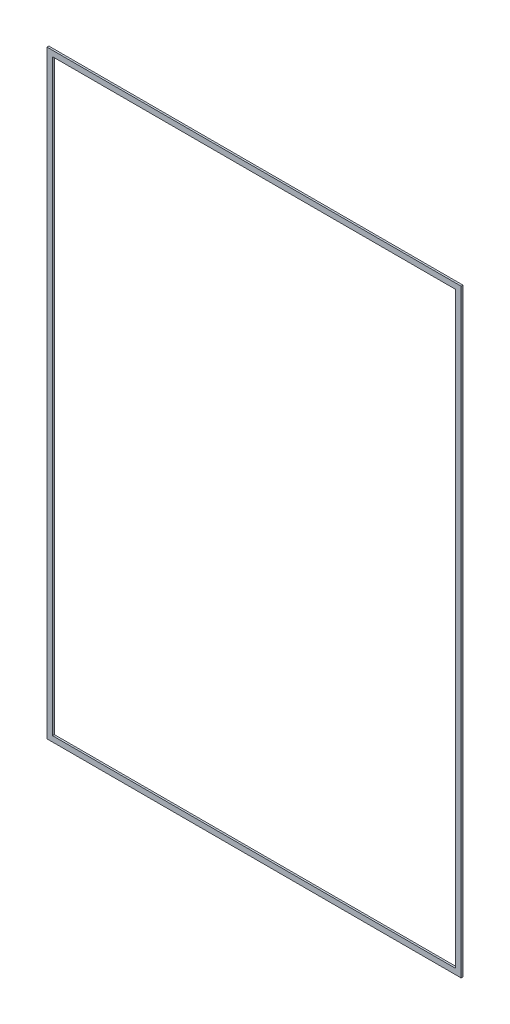
ISO-10303-21;
HEADER;
FILE_DESCRIPTION(('STEP AP214'),'2;1');
FILE_NAME('part.step','',(''),(''),'','','');
FILE_SCHEMA(('AUTOMOTIVE_DESIGN { 1 0 10303 214 1 1 1 1 }'));
ENDSEC;
DATA;
#1=APPLICATION_CONTEXT('core data for automotive mechanical design processes');
#2=APPLICATION_PROTOCOL_DEFINITION('international standard','automotive_design',2000,#1);
#3=PRODUCT_CONTEXT('',#1,'mechanical');
#4=PRODUCT('Part','Part','',(#3));
#5=PRODUCT_RELATED_PRODUCT_CATEGORY('part','',(#4));
#6=PRODUCT_DEFINITION_FORMATION('','',#4);
#7=PRODUCT_DEFINITION_CONTEXT('part definition',#1,'design');
#8=PRODUCT_DEFINITION('design','',#6,#7);
#9=PRODUCT_DEFINITION_SHAPE('','',#8);
#10=(LENGTH_UNIT() NAMED_UNIT(*) SI_UNIT(.MILLI.,.METRE.));
#11=(NAMED_UNIT(*) PLANE_ANGLE_UNIT() SI_UNIT($,.RADIAN.));
#12=(NAMED_UNIT(*) SI_UNIT($,.STERADIAN.) SOLID_ANGLE_UNIT());
#13=UNCERTAINTY_MEASURE_WITH_UNIT(LENGTH_MEASURE(1.E-05),#10,'distance_accuracy_value','');
#14=(GEOMETRIC_REPRESENTATION_CONTEXT(3) GLOBAL_UNCERTAINTY_ASSIGNED_CONTEXT((#13)) GLOBAL_UNIT_ASSIGNED_CONTEXT((#10,
#11,#12)) REPRESENTATION_CONTEXT('',''));
#15=CARTESIAN_POINT('',(0.,0.,0.));
#16=DIRECTION('',(0.,0.,1.));
#17=DIRECTION('',(1.,0.,0.));
#18=AXIS2_PLACEMENT_3D('',#15,#16,#17);
#19=CARTESIAN_POINT('',(0.,0.,1.));
#20=DIRECTION('',(0.,0.,-1.));
#21=DIRECTION('',(-1.,0.,0.));
#22=AXIS2_PLACEMENT_3D('',#19,#20,#21);
#23=PLANE('',#22);
#24=DIRECTION('',(0.,-1.,0.));
#25=VECTOR('',#24,1.);
#26=CARTESIAN_POINT('',(0.,0.,1.));
#27=LINE('',#26,#25);
#28=CARTESIAN_POINT('',(0.,324.,1.));
#29=VERTEX_POINT('',#28);
#30=CARTESIAN_POINT('',(0.,0.,1.));
#31=VERTEX_POINT('',#30);
#32=EDGE_CURVE('E139',#29,#31,#27,.T.);
#33=ORIENTED_EDGE('',*,*,#32,.T.);
#34=DIRECTION('',(1.,0.,0.));
#35=VECTOR('',#34,1.);
#36=CARTESIAN_POINT('',(0.,0.,1.));
#37=LINE('',#36,#35);
#38=CARTESIAN_POINT('',(224.,0.,1.));
#39=VERTEX_POINT('',#38);
#40=EDGE_CURVE('E142',#31,#39,#37,.T.);
#41=ORIENTED_EDGE('',*,*,#40,.T.);
#42=DIRECTION('',(0.,1.,0.));
#43=VECTOR('',#42,1.);
#44=CARTESIAN_POINT('',(224.,0.,1.));
#45=LINE('',#44,#43);
#46=CARTESIAN_POINT('',(224.,324.,1.));
#47=VERTEX_POINT('',#46);
#48=EDGE_CURVE('E147',#39,#47,#45,.T.);
#49=ORIENTED_EDGE('',*,*,#48,.T.);
#50=DIRECTION('',(-1.,0.,0.));
#51=VECTOR('',#50,1.);
#52=CARTESIAN_POINT('',(0.,324.,1.));
#53=LINE('',#52,#51);
#54=EDGE_CURVE('E149',#47,#29,#53,.T.);
#55=ORIENTED_EDGE('',*,*,#54,.T.);
#56=EDGE_LOOP('',(#33,#41,#49,#55));
#57=FACE_BOUND('',#56,.T.);
#58=DIRECTION('',(0.,-1.,0.));
#59=VECTOR('',#58,1.);
#60=CARTESIAN_POINT('',(3.,3.,1.));
#61=LINE('',#60,#59);
#62=CARTESIAN_POINT('',(3.,321.,1.));
#63=VERTEX_POINT('',#62);
#64=CARTESIAN_POINT('',(3.,3.,1.));
#65=VERTEX_POINT('',#64);
#66=EDGE_CURVE('E101',#63,#65,#61,.T.);
#67=ORIENTED_EDGE('',*,*,#66,.F.);
#68=DIRECTION('',(-1.,0.,0.));
#69=VECTOR('',#68,1.);
#70=CARTESIAN_POINT('',(3.,321.,1.));
#71=LINE('',#70,#69);
#72=CARTESIAN_POINT('',(221.,321.,1.));
#73=VERTEX_POINT('',#72);
#74=EDGE_CURVE('E128',#73,#63,#71,.T.);
#75=ORIENTED_EDGE('',*,*,#74,.F.);
#76=DIRECTION('',(0.,1.,0.));
#77=VECTOR('',#76,1.);
#78=CARTESIAN_POINT('',(221.,3.,1.));
#79=LINE('',#78,#77);
#80=CARTESIAN_POINT('',(221.,3.,1.));
#81=VERTEX_POINT('',#80);
#82=EDGE_CURVE('E125',#81,#73,#79,.T.);
#83=ORIENTED_EDGE('',*,*,#82,.F.);
#84=DIRECTION('',(1.,0.,0.));
#85=VECTOR('',#84,1.);
#86=CARTESIAN_POINT('',(3.,3.,1.));
#87=LINE('',#86,#85);
#88=EDGE_CURVE('E115',#65,#81,#87,.T.);
#89=ORIENTED_EDGE('',*,*,#88,.F.);
#90=EDGE_LOOP('',(#67,#75,#83,#89));
#91=FACE_BOUND('',#90,.T.);
#92=ADVANCED_FACE('F39',(#57,#91),#23,.F.);
#93=CARTESIAN_POINT('',(0.,0.,0.));
#94=DIRECTION('',(0.,0.,-1.));
#95=DIRECTION('',(-1.,0.,0.));
#96=AXIS2_PLACEMENT_3D('',#93,#94,#95);
#97=PLANE('',#96);
#98=DIRECTION('',(0.,-1.,0.));
#99=VECTOR('',#98,1.);
#100=CARTESIAN_POINT('',(0.,0.,0.));
#101=LINE('',#100,#99);
#102=CARTESIAN_POINT('',(0.,324.,0.));
#103=VERTEX_POINT('',#102);
#104=CARTESIAN_POINT('',(0.,0.,0.));
#105=VERTEX_POINT('',#104);
#106=EDGE_CURVE('E120',#103,#105,#101,.T.);
#107=ORIENTED_EDGE('',*,*,#106,.F.);
#108=DIRECTION('',(-1.,0.,0.));
#109=VECTOR('',#108,1.);
#110=CARTESIAN_POINT('',(0.,324.,0.));
#111=LINE('',#110,#109);
#112=CARTESIAN_POINT('',(224.,324.,0.));
#113=VERTEX_POINT('',#112);
#114=EDGE_CURVE('E143',#113,#103,#111,.T.);
#115=ORIENTED_EDGE('',*,*,#114,.F.);
#116=DIRECTION('',(0.,1.,0.));
#117=VECTOR('',#116,1.);
#118=CARTESIAN_POINT('',(224.,0.,0.));
#119=LINE('',#118,#117);
#120=CARTESIAN_POINT('',(224.,0.,0.));
#121=VERTEX_POINT('',#120);
#122=EDGE_CURVE('E155',#121,#113,#119,.T.);
#123=ORIENTED_EDGE('',*,*,#122,.F.);
#124=DIRECTION('',(1.,0.,0.));
#125=VECTOR('',#124,1.);
#126=CARTESIAN_POINT('',(0.,0.,0.));
#127=LINE('',#126,#125);
#128=EDGE_CURVE('E154',#105,#121,#127,.T.);
#129=ORIENTED_EDGE('',*,*,#128,.F.);
#130=EDGE_LOOP('',(#107,#115,#123,#129));
#131=FACE_BOUND('',#130,.T.);
#132=DIRECTION('',(-1.,0.,0.));
#133=VECTOR('',#132,1.);
#134=CARTESIAN_POINT('',(3.,321.,0.));
#135=LINE('',#134,#133);
#136=CARTESIAN_POINT('',(221.,321.,0.));
#137=VERTEX_POINT('',#136);
#138=CARTESIAN_POINT('',(3.,321.,0.));
#139=VERTEX_POINT('',#138);
#140=EDGE_CURVE('E111',#137,#139,#135,.T.);
#141=ORIENTED_EDGE('',*,*,#140,.T.);
#142=DIRECTION('',(0.,-1.,0.));
#143=VECTOR('',#142,1.);
#144=CARTESIAN_POINT('',(3.,3.,0.));
#145=LINE('',#144,#143);
#146=CARTESIAN_POINT('',(3.,3.,0.));
#147=VERTEX_POINT('',#146);
#148=EDGE_CURVE('E62',#139,#147,#145,.T.);
#149=ORIENTED_EDGE('',*,*,#148,.T.);
#150=DIRECTION('',(1.,0.,0.));
#151=VECTOR('',#150,1.);
#152=CARTESIAN_POINT('',(3.,3.,0.));
#153=LINE('',#152,#151);
#154=CARTESIAN_POINT('',(221.,3.,0.));
#155=VERTEX_POINT('',#154);
#156=EDGE_CURVE('E118',#147,#155,#153,.T.);
#157=ORIENTED_EDGE('',*,*,#156,.T.);
#158=DIRECTION('',(0.,1.,0.));
#159=VECTOR('',#158,1.);
#160=CARTESIAN_POINT('',(221.,3.,0.));
#161=LINE('',#160,#159);
#162=EDGE_CURVE('E135',#155,#137,#161,.T.);
#163=ORIENTED_EDGE('',*,*,#162,.T.);
#164=EDGE_LOOP('',(#141,#149,#157,#163));
#165=FACE_BOUND('',#164,.T.);
#166=ADVANCED_FACE('F171',(#131,#165),#97,.T.);
#167=CARTESIAN_POINT('',(0.,0.,1.));
#168=DIRECTION('',(1.,0.,0.));
#169=DIRECTION('',(0.,0.,-1.));
#170=AXIS2_PLACEMENT_3D('',#167,#168,#169);
#171=PLANE('',#170);
#172=ORIENTED_EDGE('',*,*,#106,.T.);
#173=DIRECTION('',(0.,0.,-1.));
#174=VECTOR('',#173,1.);
#175=CARTESIAN_POINT('',(0.,0.,1.));
#176=LINE('',#175,#174);
#177=EDGE_CURVE('E11',#31,#105,#176,.T.);
#178=ORIENTED_EDGE('',*,*,#177,.F.);
#179=ORIENTED_EDGE('',*,*,#32,.F.);
#180=DIRECTION('',(0.,0.,-1.));
#181=VECTOR('',#180,1.);
#182=CARTESIAN_POINT('',(0.,324.,1.));
#183=LINE('',#182,#181);
#184=EDGE_CURVE('E148',#29,#103,#183,.T.);
#185=ORIENTED_EDGE('',*,*,#184,.T.);
#186=EDGE_LOOP('',(#172,#178,#179,#185));
#187=FACE_BOUND('',#186,.T.);
#188=ADVANCED_FACE('F41',(#187),#171,.F.);
#189=CARTESIAN_POINT('',(0.,0.,1.));
#190=DIRECTION('',(0.,1.,0.));
#191=DIRECTION('',(0.,0.,1.));
#192=AXIS2_PLACEMENT_3D('',#189,#190,#191);
#193=PLANE('',#192);
#194=ORIENTED_EDGE('',*,*,#128,.T.);
#195=DIRECTION('',(0.,0.,-1.));
#196=VECTOR('',#195,1.);
#197=CARTESIAN_POINT('',(224.,0.,1.));
#198=LINE('',#197,#196);
#199=EDGE_CURVE('E50',#39,#121,#198,.T.);
#200=ORIENTED_EDGE('',*,*,#199,.F.);
#201=ORIENTED_EDGE('',*,*,#40,.F.);
#202=ORIENTED_EDGE('',*,*,#177,.T.);
#203=EDGE_LOOP('',(#194,#200,#201,#202));
#204=FACE_BOUND('',#203,.T.);
#205=ADVANCED_FACE('F183',(#204),#193,.F.);
#206=CARTESIAN_POINT('',(224.,0.,1.));
#207=DIRECTION('',(-1.,0.,0.));
#208=DIRECTION('',(0.,0.,1.));
#209=AXIS2_PLACEMENT_3D('',#206,#207,#208);
#210=PLANE('',#209);
#211=ORIENTED_EDGE('',*,*,#122,.T.);
#212=DIRECTION('',(0.,0.,-1.));
#213=VECTOR('',#212,1.);
#214=CARTESIAN_POINT('',(224.,324.,1.));
#215=LINE('',#214,#213);
#216=EDGE_CURVE('E158',#47,#113,#215,.T.);
#217=ORIENTED_EDGE('',*,*,#216,.F.);
#218=ORIENTED_EDGE('',*,*,#48,.F.);
#219=ORIENTED_EDGE('',*,*,#199,.T.);
#220=EDGE_LOOP('',(#211,#217,#218,#219));
#221=FACE_BOUND('',#220,.T.);
#222=ADVANCED_FACE('F167',(#221),#210,.F.);
#223=CARTESIAN_POINT('',(0.,324.,1.));
#224=DIRECTION('',(0.,-1.,0.));
#225=DIRECTION('',(0.,0.,-1.));
#226=AXIS2_PLACEMENT_3D('',#223,#224,#225);
#227=PLANE('',#226);
#228=ORIENTED_EDGE('',*,*,#114,.T.);
#229=ORIENTED_EDGE('',*,*,#184,.F.);
#230=ORIENTED_EDGE('',*,*,#54,.F.);
#231=ORIENTED_EDGE('',*,*,#216,.T.);
#232=EDGE_LOOP('',(#228,#229,#230,#231));
#233=FACE_BOUND('',#232,.T.);
#234=ADVANCED_FACE('F180',(#233),#227,.F.);
#235=CARTESIAN_POINT('',(3.,3.,1.));
#236=DIRECTION('',(1.,0.,0.));
#237=DIRECTION('',(0.,0.,-1.));
#238=AXIS2_PLACEMENT_3D('',#235,#236,#237);
#239=PLANE('',#238);
#240=ORIENTED_EDGE('',*,*,#148,.F.);
#241=DIRECTION('',(0.,0.,-1.));
#242=VECTOR('',#241,1.);
#243=CARTESIAN_POINT('',(3.,321.,1.));
#244=LINE('',#243,#242);
#245=EDGE_CURVE('E109',#63,#139,#244,.T.);
#246=ORIENTED_EDGE('',*,*,#245,.F.);
#247=ORIENTED_EDGE('',*,*,#66,.T.);
#248=DIRECTION('',(0.,0.,-1.));
#249=VECTOR('',#248,1.);
#250=CARTESIAN_POINT('',(3.,3.,1.));
#251=LINE('',#250,#249);
#252=EDGE_CURVE('E107',#65,#147,#251,.T.);
#253=ORIENTED_EDGE('',*,*,#252,.T.);
#254=EDGE_LOOP('',(#240,#246,#247,#253));
#255=FACE_BOUND('',#254,.T.);
#256=ADVANCED_FACE('F106',(#255),#239,.T.);
#257=CARTESIAN_POINT('',(3.,3.,1.));
#258=DIRECTION('',(0.,1.,0.));
#259=DIRECTION('',(0.,0.,1.));
#260=AXIS2_PLACEMENT_3D('',#257,#258,#259);
#261=PLANE('',#260);
#262=ORIENTED_EDGE('',*,*,#156,.F.);
#263=ORIENTED_EDGE('',*,*,#252,.F.);
#264=ORIENTED_EDGE('',*,*,#88,.T.);
#265=DIRECTION('',(0.,0.,-1.));
#266=VECTOR('',#265,1.);
#267=CARTESIAN_POINT('',(221.,3.,1.));
#268=LINE('',#267,#266);
#269=EDGE_CURVE('E123',#81,#155,#268,.T.);
#270=ORIENTED_EDGE('',*,*,#269,.T.);
#271=EDGE_LOOP('',(#262,#263,#264,#270));
#272=FACE_BOUND('',#271,.T.);
#273=ADVANCED_FACE('F116',(#272),#261,.T.);
#274=CARTESIAN_POINT('',(221.,3.,1.));
#275=DIRECTION('',(-1.,0.,0.));
#276=DIRECTION('',(0.,0.,1.));
#277=AXIS2_PLACEMENT_3D('',#274,#275,#276);
#278=PLANE('',#277);
#279=ORIENTED_EDGE('',*,*,#162,.F.);
#280=ORIENTED_EDGE('',*,*,#269,.F.);
#281=ORIENTED_EDGE('',*,*,#82,.T.);
#282=DIRECTION('',(0.,0.,-1.));
#283=VECTOR('',#282,1.);
#284=CARTESIAN_POINT('',(221.,321.,1.));
#285=LINE('',#284,#283);
#286=EDGE_CURVE('E53',#73,#137,#285,.T.);
#287=ORIENTED_EDGE('',*,*,#286,.T.);
#288=EDGE_LOOP('',(#279,#280,#281,#287));
#289=FACE_BOUND('',#288,.T.);
#290=ADVANCED_FACE('F206',(#289),#278,.T.);
#291=CARTESIAN_POINT('',(3.,321.,1.));
#292=DIRECTION('',(0.,-1.,0.));
#293=DIRECTION('',(0.,0.,-1.));
#294=AXIS2_PLACEMENT_3D('',#291,#292,#293);
#295=PLANE('',#294);
#296=ORIENTED_EDGE('',*,*,#140,.F.);
#297=ORIENTED_EDGE('',*,*,#286,.F.);
#298=ORIENTED_EDGE('',*,*,#74,.T.);
#299=ORIENTED_EDGE('',*,*,#245,.T.);
#300=EDGE_LOOP('',(#296,#297,#298,#299));
#301=FACE_BOUND('',#300,.T.);
#302=ADVANCED_FACE('F210',(#301),#295,.T.);
#303=CLOSED_SHELL('',(#92,#166,#188,#205,#222,#234,#256,#273,#290,#302));
#304=MANIFOLD_SOLID_BREP('B2',#303);
#305=ADVANCED_BREP_SHAPE_REPRESENTATION('',(#18,#304),#14);
#306=SHAPE_DEFINITION_REPRESENTATION(#9,#305);
ENDSEC;
END-ISO-10303-21;
